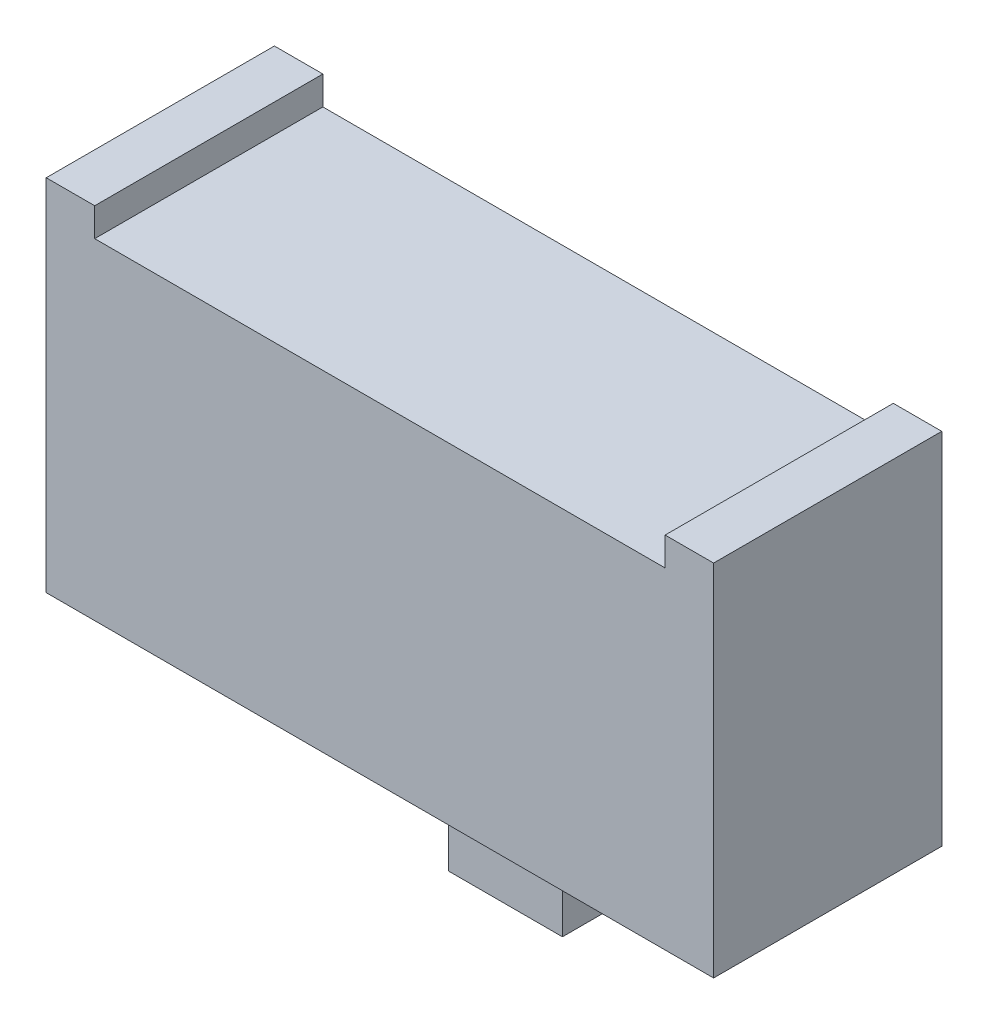
ISO-10303-21;
HEADER;
FILE_DESCRIPTION(('STEP AP214'),'2;1');
FILE_NAME('part.step','',(''),(''),'','','');
FILE_SCHEMA(('AUTOMOTIVE_DESIGN { 1 0 10303 214 1 1 1 1 }'));
ENDSEC;
DATA;
#1=APPLICATION_CONTEXT('core data for automotive mechanical design processes');
#2=APPLICATION_PROTOCOL_DEFINITION('international standard','automotive_design',2000,#1);
#3=PRODUCT_CONTEXT('',#1,'mechanical');
#4=PRODUCT('Part','Part','',(#3));
#5=PRODUCT_RELATED_PRODUCT_CATEGORY('part','',(#4));
#6=PRODUCT_DEFINITION_FORMATION('','',#4);
#7=PRODUCT_DEFINITION_CONTEXT('part definition',#1,'design');
#8=PRODUCT_DEFINITION('design','',#6,#7);
#9=PRODUCT_DEFINITION_SHAPE('','',#8);
#10=(LENGTH_UNIT() NAMED_UNIT(*) SI_UNIT(.MILLI.,.METRE.));
#11=(NAMED_UNIT(*) PLANE_ANGLE_UNIT() SI_UNIT($,.RADIAN.));
#12=(NAMED_UNIT(*) SI_UNIT($,.STERADIAN.) SOLID_ANGLE_UNIT());
#13=UNCERTAINTY_MEASURE_WITH_UNIT(LENGTH_MEASURE(1.E-05),#10,'distance_accuracy_value','');
#14=(GEOMETRIC_REPRESENTATION_CONTEXT(3) GLOBAL_UNCERTAINTY_ASSIGNED_CONTEXT((#13)) GLOBAL_UNIT_ASSIGNED_CONTEXT((#10,
#11,#12)) REPRESENTATION_CONTEXT('',''));
#15=CARTESIAN_POINT('',(0.,0.,0.));
#16=DIRECTION('',(0.,0.,1.));
#17=DIRECTION('',(1.,0.,0.));
#18=AXIS2_PLACEMENT_3D('',#15,#16,#17);
#19=CARTESIAN_POINT('',(37.671429042252,-22.700893810559,-9.79989381056));
#20=DIRECTION('',(1.,0.,0.));
#21=DIRECTION('',(0.,-1.,0.));
#22=AXIS2_PLACEMENT_3D('',#19,#20,#21);
#23=PLANE('',#22);
#24=DIRECTION('',(0.,0.,1.));
#25=VECTOR('',#24,1.);
#26=CARTESIAN_POINT('',(37.671429042252,-22.700893810559,-8.79989381055999));
#27=LINE('',#26,#25);
#28=CARTESIAN_POINT('',(37.671429042252,-22.700893810559,-9.79989381056));
#29=VERTEX_POINT('',#28);
#30=CARTESIAN_POINT('',(37.671429042252,-22.700893810559,-5.79989381055999));
#31=VERTEX_POINT('',#30);
#32=EDGE_CURVE('E224',#29,#31,#27,.T.);
#33=ORIENTED_EDGE('',*,*,#32,.F.);
#34=DIRECTION('',(0.,1.,0.));
#35=VECTOR('',#34,1.);
#36=CARTESIAN_POINT('',(37.671429042252,-25.850893810559,-9.79989381056));
#37=LINE('',#36,#35);
#38=CARTESIAN_POINT('',(37.671429042252,-23.200893810559,-9.79989381056));
#39=VERTEX_POINT('',#38);
#40=EDGE_CURVE('E39',#39,#29,#37,.T.);
#41=ORIENTED_EDGE('',*,*,#40,.F.);
#42=DIRECTION('',(0.,0.,1.));
#43=VECTOR('',#42,1.);
#44=CARTESIAN_POINT('',(37.671429042252,-23.200893810559,-9.79989381056));
#45=LINE('',#44,#43);
#46=CARTESIAN_POINT('',(37.671429042252,-23.200893810559,-5.79989381056));
#47=VERTEX_POINT('',#46);
#48=EDGE_CURVE('E10',#39,#47,#45,.T.);
#49=ORIENTED_EDGE('',*,*,#48,.T.);
#50=DIRECTION('',(0.,-1.,0.));
#51=VECTOR('',#50,1.);
#52=CARTESIAN_POINT('',(37.671429042252,-25.850893810559,-5.79989381056));
#53=LINE('',#52,#51);
#54=EDGE_CURVE('E217',#31,#47,#53,.T.);
#55=ORIENTED_EDGE('',*,*,#54,.F.);
#56=EDGE_LOOP('',(#33,#41,#49,#55));
#57=FACE_BOUND('',#56,.T.);
#58=ADVANCED_FACE('F16',(#57),#23,.F.);
#59=CARTESIAN_POINT('',(27.671429042252,-22.700893810559,-5.79989381056007));
#60=DIRECTION('',(-1.,0.,0.));
#61=DIRECTION('',(0.,0.,-1.));
#62=AXIS2_PLACEMENT_3D('',#59,#60,#61);
#63=PLANE('',#62);
#64=DIRECTION('',(0.,0.,-1.));
#65=VECTOR('',#64,1.);
#66=CARTESIAN_POINT('',(27.671429042252,-22.700893810559,-6.79989381056007));
#67=LINE('',#66,#65);
#68=CARTESIAN_POINT('',(27.671429042252,-22.700893810559,-5.79989381056007));
#69=VERTEX_POINT('',#68);
#70=CARTESIAN_POINT('',(27.671429042252,-22.700893810559,-9.79989381056008));
#71=VERTEX_POINT('',#70);
#72=EDGE_CURVE('E191',#69,#71,#67,.T.);
#73=ORIENTED_EDGE('',*,*,#72,.F.);
#74=DIRECTION('',(0.,1.,0.));
#75=VECTOR('',#74,1.);
#76=CARTESIAN_POINT('',(27.671429042252,-25.850893810559,-5.79989381056008));
#77=LINE('',#76,#75);
#78=CARTESIAN_POINT('',(27.671429042252,-23.200893810559,-5.79989381056008));
#79=VERTEX_POINT('',#78);
#80=EDGE_CURVE('E218',#79,#69,#77,.T.);
#81=ORIENTED_EDGE('',*,*,#80,.F.);
#82=DIRECTION('',(0.,0.,-1.));
#83=VECTOR('',#82,1.);
#84=CARTESIAN_POINT('',(27.671429042252,-23.200893810559,-5.79989381056008));
#85=LINE('',#84,#83);
#86=CARTESIAN_POINT('',(27.671429042252,-23.200893810559,-9.79989381056008));
#87=VERTEX_POINT('',#86);
#88=EDGE_CURVE('E26',#79,#87,#85,.T.);
#89=ORIENTED_EDGE('',*,*,#88,.T.);
#90=DIRECTION('',(0.,-1.,0.));
#91=VECTOR('',#90,1.);
#92=CARTESIAN_POINT('',(27.671429042252,-25.850893810559,-9.79989381056008));
#93=LINE('',#92,#91);
#94=EDGE_CURVE('E228',#71,#87,#93,.T.);
#95=ORIENTED_EDGE('',*,*,#94,.F.);
#96=EDGE_LOOP('',(#73,#81,#89,#95));
#97=FACE_BOUND('',#96,.T.);
#98=ADVANCED_FACE('F642',(#97),#63,.F.);
#99=CARTESIAN_POINT('',(32.671429042252,-23.200893810559,-7.79989381056003));
#100=DIRECTION('',(0.,-1.,0.));
#101=DIRECTION('',(-1.,0.,0.));
#102=AXIS2_PLACEMENT_3D('',#99,#100,#101);
#103=PLANE('',#102);
#104=DIRECTION('',(-1.,0.,0.));
#105=VECTOR('',#104,1.);
#106=CARTESIAN_POINT('',(29.746429042252,-23.200893810559,-5.79989381056006));
#107=LINE('',#106,#105);
#108=EDGE_CURVE('E213',#47,#79,#107,.T.);
#109=ORIENTED_EDGE('',*,*,#108,.F.);
#110=ORIENTED_EDGE('',*,*,#48,.F.);
#111=DIRECTION('',(1.,0.,0.));
#112=VECTOR('',#111,1.);
#113=CARTESIAN_POINT('',(35.596429042252,-23.200893810559,-9.79989381056001));
#114=LINE('',#113,#112);
#115=EDGE_CURVE('E232',#87,#39,#114,.T.);
#116=ORIENTED_EDGE('',*,*,#115,.F.);
#117=ORIENTED_EDGE('',*,*,#88,.F.);
#118=EDGE_LOOP('',(#109,#110,#116,#117));
#119=FACE_BOUND('',#118,.T.);
#120=ADVANCED_FACE('F632',(#119),#103,.F.);
#121=CARTESIAN_POINT('',(32.671429042252,-22.700893810559,-7.79989381056003));
#122=DIRECTION('',(0.,1.,0.));
#123=DIRECTION('',(0.,0.,1.));
#124=AXIS2_PLACEMENT_3D('',#121,#122,#123);
#125=PLANE('',#124);
#126=ORIENTED_EDGE('',*,*,#72,.T.);
#127=DIRECTION('',(-1.,0.,0.));
#128=VECTOR('',#127,1.);
#129=CARTESIAN_POINT('',(38.521429042252,-22.700893810559,-9.79989381055999));
#130=LINE('',#129,#128);
#131=CARTESIAN_POINT('',(26.821429042252,-22.700893810559,-9.79989381056008));
#132=VERTEX_POINT('',#131);
#133=EDGE_CURVE('E195',#71,#132,#130,.T.);
#134=ORIENTED_EDGE('',*,*,#133,.T.);
#135=DIRECTION('',(0.,0.,1.));
#136=VECTOR('',#135,1.);
#137=CARTESIAN_POINT('',(26.821429042252,-22.700893810559,-9.79989381056008));
#138=LINE('',#137,#136);
#139=CARTESIAN_POINT('',(26.821429042252,-22.700893810559,-5.79989381056008));
#140=VERTEX_POINT('',#139);
#141=EDGE_CURVE('E223',#132,#140,#138,.T.);
#142=ORIENTED_EDGE('',*,*,#141,.T.);
#143=DIRECTION('',(1.,0.,0.));
#144=VECTOR('',#143,1.);
#145=CARTESIAN_POINT('',(26.821429042252,-22.700893810559,-5.79989381056008));
#146=LINE('',#145,#144);
#147=EDGE_CURVE('E219',#140,#69,#146,.T.);
#148=ORIENTED_EDGE('',*,*,#147,.T.);
#149=EDGE_LOOP('',(#126,#134,#142,#148));
#150=FACE_BOUND('',#149,.T.);
#151=ADVANCED_FACE('F623',(#150),#125,.T.);
#152=CARTESIAN_POINT('',(32.671429042252,-22.700893810559,-7.79989381056003));
#153=DIRECTION('',(0.,1.,0.));
#154=DIRECTION('',(0.,0.,1.));
#155=AXIS2_PLACEMENT_3D('',#152,#153,#154);
#156=PLANE('',#155);
#157=ORIENTED_EDGE('',*,*,#32,.T.);
#158=DIRECTION('',(1.,0.,0.));
#159=VECTOR('',#158,1.);
#160=CARTESIAN_POINT('',(26.821429042252,-22.700893810559,-5.79989381056008));
#161=LINE('',#160,#159);
#162=CARTESIAN_POINT('',(38.521429042252,-22.700893810559,-5.79989381055999));
#163=VERTEX_POINT('',#162);
#164=EDGE_CURVE('E300',#31,#163,#161,.T.);
#165=ORIENTED_EDGE('',*,*,#164,.T.);
#166=DIRECTION('',(0.,0.,-1.));
#167=VECTOR('',#166,1.);
#168=CARTESIAN_POINT('',(38.521429042252,-22.700893810559,-5.79989381055999));
#169=LINE('',#168,#167);
#170=CARTESIAN_POINT('',(38.521429042252,-22.700893810559,-9.79989381055999));
#171=VERTEX_POINT('',#170);
#172=EDGE_CURVE('E296',#163,#171,#169,.T.);
#173=ORIENTED_EDGE('',*,*,#172,.T.);
#174=DIRECTION('',(-1.,0.,0.));
#175=VECTOR('',#174,1.);
#176=CARTESIAN_POINT('',(38.521429042252,-22.700893810559,-9.79989381055999));
#177=LINE('',#176,#175);
#178=EDGE_CURVE('E301',#171,#29,#177,.T.);
#179=ORIENTED_EDGE('',*,*,#178,.T.);
#180=EDGE_LOOP('',(#157,#165,#173,#179));
#181=FACE_BOUND('',#180,.T.);
#182=ADVANCED_FACE('F344',(#181),#156,.T.);
#183=CARTESIAN_POINT('',(26.821429042252,-29.000893810559,-5.79989381056009));
#184=DIRECTION('',(0.,0.,1.));
#185=DIRECTION('',(0.,1.,0.));
#186=AXIS2_PLACEMENT_3D('',#183,#184,#185);
#187=PLANE('',#186);
#188=ORIENTED_EDGE('',*,*,#54,.T.);
#189=ORIENTED_EDGE('',*,*,#108,.T.);
#190=ORIENTED_EDGE('',*,*,#80,.T.);
#191=ORIENTED_EDGE('',*,*,#147,.F.);
#192=DIRECTION('',(0.,1.,0.));
#193=VECTOR('',#192,1.);
#194=CARTESIAN_POINT('',(26.821429042252,-29.000893810559,-5.79989381056009));
#195=LINE('',#194,#193);
#196=CARTESIAN_POINT('',(26.821429042252,-29.000893810559,-5.79989381056009));
#197=VERTEX_POINT('',#196);
#198=EDGE_CURVE('E202',#197,#140,#195,.T.);
#199=ORIENTED_EDGE('',*,*,#198,.F.);
#200=DIRECTION('',(1.,0.,0.));
#201=VECTOR('',#200,1.);
#202=CARTESIAN_POINT('',(26.821429042252,-29.000893810559,-5.79989381056009));
#203=LINE('',#202,#201);
#204=CARTESIAN_POINT('',(38.521429042252,-29.000893810559,-5.79989381056));
#205=VERTEX_POINT('',#204);
#206=EDGE_CURVE('E265',#197,#205,#203,.T.);
#207=ORIENTED_EDGE('',*,*,#206,.T.);
#208=DIRECTION('',(0.,1.,0.));
#209=VECTOR('',#208,1.);
#210=CARTESIAN_POINT('',(38.521429042252,-29.000893810559,-5.79989381056));
#211=LINE('',#210,#209);
#212=EDGE_CURVE('E261',#205,#163,#211,.T.);
#213=ORIENTED_EDGE('',*,*,#212,.T.);
#214=ORIENTED_EDGE('',*,*,#164,.F.);
#215=EDGE_LOOP('',(#188,#189,#190,#191,#199,#207,#213,#214));
#216=FACE_BOUND('',#215,.T.);
#217=ADVANCED_FACE('F346',(#216),#187,.T.);
#218=CARTESIAN_POINT('',(34.871429042252,-29.000893810559,-8.79989381056003));
#219=DIRECTION('',(1.,0.,0.));
#220=DIRECTION('',(0.,-1.,0.));
#221=AXIS2_PLACEMENT_3D('',#218,#219,#220);
#222=PLANE('',#221);
#223=DIRECTION('',(0.,0.,-1.));
#224=VECTOR('',#223,1.);
#225=CARTESIAN_POINT('',(34.871429042252,-29.000893810559,-7.29989381056003));
#226=LINE('',#225,#224);
#227=CARTESIAN_POINT('',(34.871429042252,-29.000893810559,-6.79989381056003));
#228=VERTEX_POINT('',#227);
#229=CARTESIAN_POINT('',(34.871429042252,-29.000893810559,-8.79989381056003));
#230=VERTEX_POINT('',#229);
#231=EDGE_CURVE('E244',#228,#230,#226,.T.);
#232=ORIENTED_EDGE('',*,*,#231,.F.);
#233=DIRECTION('',(0.,1.,0.));
#234=VECTOR('',#233,1.);
#235=CARTESIAN_POINT('',(34.871429042252,-29.000893810559,-6.79989381056003));
#236=LINE('',#235,#234);
#237=CARTESIAN_POINT('',(34.871429042252,-30.700893810559,-6.79989381056003));
#238=VERTEX_POINT('',#237);
#239=EDGE_CURVE('E177',#238,#228,#236,.T.);
#240=ORIENTED_EDGE('',*,*,#239,.F.);
#241=DIRECTION('',(0.,0.,1.));
#242=VECTOR('',#241,1.);
#243=CARTESIAN_POINT('',(34.871429042252,-30.700893810559,-6.79989381056003));
#244=LINE('',#243,#242);
#245=CARTESIAN_POINT('',(34.871429042252,-30.700893810559,-8.79989381056003));
#246=VERTEX_POINT('',#245);
#247=EDGE_CURVE('E180',#246,#238,#244,.T.);
#248=ORIENTED_EDGE('',*,*,#247,.F.);
#249=DIRECTION('',(0.,-1.,0.));
#250=VECTOR('',#249,1.);
#251=CARTESIAN_POINT('',(34.871429042252,-29.000893810559,-8.79989381056003));
#252=LINE('',#251,#250);
#253=EDGE_CURVE('E266',#230,#246,#252,.T.);
#254=ORIENTED_EDGE('',*,*,#253,.F.);
#255=EDGE_LOOP('',(#232,#240,#248,#254));
#256=FACE_BOUND('',#255,.T.);
#257=ADVANCED_FACE('F594',(#256),#222,.T.);
#258=CARTESIAN_POINT('',(32.871429042252,-29.000893810559,-8.79989381056005));
#259=DIRECTION('',(0.,0.,-1.));
#260=DIRECTION('',(-1.,0.,0.));
#261=AXIS2_PLACEMENT_3D('',#258,#259,#260);
#262=PLANE('',#261);
#263=DIRECTION('',(-1.,0.,0.));
#264=VECTOR('',#263,1.);
#265=CARTESIAN_POINT('',(33.771429042252,-29.000893810559,-8.79989381056004));
#266=LINE('',#265,#264);
#267=CARTESIAN_POINT('',(32.871429042252,-29.000893810559,-8.79989381056005));
#268=VERTEX_POINT('',#267);
#269=EDGE_CURVE('E242',#230,#268,#266,.T.);
#270=ORIENTED_EDGE('',*,*,#269,.F.);
#271=ORIENTED_EDGE('',*,*,#253,.T.);
#272=DIRECTION('',(1.,0.,0.));
#273=VECTOR('',#272,1.);
#274=CARTESIAN_POINT('',(34.871429042252,-30.700893810559,-8.79989381056003));
#275=LINE('',#274,#273);
#276=CARTESIAN_POINT('',(32.871429042252,-30.700893810559,-8.79989381056005));
#277=VERTEX_POINT('',#276);
#278=EDGE_CURVE('E167',#277,#246,#275,.T.);
#279=ORIENTED_EDGE('',*,*,#278,.F.);
#280=DIRECTION('',(0.,-1.,0.));
#281=VECTOR('',#280,1.);
#282=CARTESIAN_POINT('',(32.871429042252,-29.000893810559,-8.79989381056005));
#283=LINE('',#282,#281);
#284=EDGE_CURVE('E161',#268,#277,#283,.T.);
#285=ORIENTED_EDGE('',*,*,#284,.F.);
#286=EDGE_LOOP('',(#270,#271,#279,#285));
#287=FACE_BOUND('',#286,.T.);
#288=ADVANCED_FACE('F586',(#287),#262,.T.);
#289=CARTESIAN_POINT('',(32.871429042252,-29.000893810559,-6.79989381056004));
#290=DIRECTION('',(-1.,0.,0.));
#291=DIRECTION('',(0.,0.,-1.));
#292=AXIS2_PLACEMENT_3D('',#289,#290,#291);
#293=PLANE('',#292);
#294=DIRECTION('',(0.,1.,0.));
#295=VECTOR('',#294,1.);
#296=CARTESIAN_POINT('',(32.871429042252,-29.000893810559,-8.79989381056005));
#297=LINE('',#296,#295);
#298=CARTESIAN_POINT('',(32.871429042252,-28.500893810559,-8.79989381056004));
#299=VERTEX_POINT('',#298);
#300=EDGE_CURVE('E283',#268,#299,#297,.T.);
#301=ORIENTED_EDGE('',*,*,#300,.F.);
#302=ORIENTED_EDGE('',*,*,#284,.T.);
#303=DIRECTION('',(0.,0.,-1.));
#304=VECTOR('',#303,1.);
#305=CARTESIAN_POINT('',(32.871429042252,-30.700893810559,-8.79989381056005));
#306=LINE('',#305,#304);
#307=CARTESIAN_POINT('',(32.871429042252,-30.700893810559,-6.79989381056005));
#308=VERTEX_POINT('',#307);
#309=EDGE_CURVE('E154',#308,#277,#306,.T.);
#310=ORIENTED_EDGE('',*,*,#309,.F.);
#311=DIRECTION('',(0.,-1.,0.));
#312=VECTOR('',#311,1.);
#313=CARTESIAN_POINT('',(32.871429042252,-29.000893810559,-6.79989381056004));
#314=LINE('',#313,#312);
#315=CARTESIAN_POINT('',(32.871429042252,-29.000893810559,-6.79989381056004));
#316=VERTEX_POINT('',#315);
#317=EDGE_CURVE('E158',#316,#308,#314,.T.);
#318=ORIENTED_EDGE('',*,*,#317,.F.);
#319=DIRECTION('',(0.,-1.,0.));
#320=VECTOR('',#319,1.);
#321=CARTESIAN_POINT('',(32.871429042252,-29.000893810559,-6.79989381056004));
#322=LINE('',#321,#320);
#323=CARTESIAN_POINT('',(32.871429042252,-28.500893810559,-6.79989381056004));
#324=VERTEX_POINT('',#323);
#325=EDGE_CURVE('E310',#324,#316,#322,.T.);
#326=ORIENTED_EDGE('',*,*,#325,.F.);
#327=DIRECTION('',(0.,0.,1.));
#328=VECTOR('',#327,1.);
#329=CARTESIAN_POINT('',(32.871429042252,-28.500893810559,-7.29989381056004));
#330=LINE('',#329,#328);
#331=EDGE_CURVE('E201',#299,#324,#330,.T.);
#332=ORIENTED_EDGE('',*,*,#331,.F.);
#333=EDGE_LOOP('',(#301,#302,#310,#318,#326,#332));
#334=FACE_BOUND('',#333,.T.);
#335=ADVANCED_FACE('F18',(#334),#293,.T.);
#336=CARTESIAN_POINT('',(34.871429042252,-29.000893810559,-6.79989381056003));
#337=DIRECTION('',(0.,0.,1.));
#338=DIRECTION('',(1.,0.,0.));
#339=AXIS2_PLACEMENT_3D('',#336,#337,#338);
#340=PLANE('',#339);
#341=DIRECTION('',(1.,0.,0.));
#342=VECTOR('',#341,1.);
#343=CARTESIAN_POINT('',(31.571429042252,-29.000893810559,-6.79989381056006));
#344=LINE('',#343,#342);
#345=EDGE_CURVE('E174',#316,#228,#344,.T.);
#346=ORIENTED_EDGE('',*,*,#345,.F.);
#347=ORIENTED_EDGE('',*,*,#317,.T.);
#348=DIRECTION('',(-1.,0.,0.));
#349=VECTOR('',#348,1.);
#350=CARTESIAN_POINT('',(32.871429042252,-30.700893810559,-6.79989381056005));
#351=LINE('',#350,#349);
#352=EDGE_CURVE('E166',#238,#308,#351,.T.);
#353=ORIENTED_EDGE('',*,*,#352,.F.);
#354=ORIENTED_EDGE('',*,*,#239,.T.);
#355=EDGE_LOOP('',(#346,#347,#353,#354));
#356=FACE_BOUND('',#355,.T.);
#357=ADVANCED_FACE('F171',(#356),#340,.T.);
#358=CARTESIAN_POINT('',(33.871429042252,-30.700893810559,-7.79989381056004));
#359=DIRECTION('',(0.,-1.,0.));
#360=DIRECTION('',(-1.,0.,0.));
#361=AXIS2_PLACEMENT_3D('',#358,#359,#360);
#362=PLANE('',#361);
#363=ORIENTED_EDGE('',*,*,#352,.T.);
#364=ORIENTED_EDGE('',*,*,#309,.T.);
#365=ORIENTED_EDGE('',*,*,#278,.T.);
#366=ORIENTED_EDGE('',*,*,#247,.T.);
#367=EDGE_LOOP('',(#363,#364,#365,#366));
#368=FACE_BOUND('',#367,.T.);
#369=ADVANCED_FACE('F179',(#368),#362,.T.);
#370=CARTESIAN_POINT('',(34.871429042252,-29.000893810559,-8.79989381056003));
#371=DIRECTION('',(0.,0.,-1.));
#372=DIRECTION('',(-1.,0.,0.));
#373=AXIS2_PLACEMENT_3D('',#370,#371,#372);
#374=PLANE('',#373);
#375=ORIENTED_EDGE('',*,*,#300,.T.);
#376=DIRECTION('',(-1.,0.,0.));
#377=VECTOR('',#376,1.);
#378=CARTESIAN_POINT('',(34.871429042252,-28.500893810559,-8.79989381056003));
#379=LINE('',#378,#377);
#380=CARTESIAN_POINT('',(30.471429042252,-28.500893810559,-8.79989381056006));
#381=VERTEX_POINT('',#380);
#382=EDGE_CURVE('E276',#299,#381,#379,.T.);
#383=ORIENTED_EDGE('',*,*,#382,.T.);
#384=DIRECTION('',(0.,1.,0.));
#385=VECTOR('',#384,1.);
#386=CARTESIAN_POINT('',(30.471429042252,-29.000893810559,-8.79989381056006));
#387=LINE('',#386,#385);
#388=CARTESIAN_POINT('',(30.471429042252,-29.000893810559,-8.79989381056006));
#389=VERTEX_POINT('',#388);
#390=EDGE_CURVE('E273',#389,#381,#387,.T.);
#391=ORIENTED_EDGE('',*,*,#390,.F.);
#392=DIRECTION('',(-1.,0.,0.));
#393=VECTOR('',#392,1.);
#394=CARTESIAN_POINT('',(33.771429042252,-29.000893810559,-8.79989381056004));
#395=LINE('',#394,#393);
#396=EDGE_CURVE('E245',#268,#389,#395,.T.);
#397=ORIENTED_EDGE('',*,*,#396,.F.);
#398=EDGE_LOOP('',(#375,#383,#391,#397));
#399=FACE_BOUND('',#398,.T.);
#400=ADVANCED_FACE('F548',(#399),#374,.F.);
#401=CARTESIAN_POINT('',(30.471429042252,-29.000893810559,-8.79989381056006));
#402=DIRECTION('',(-1.,0.,0.));
#403=DIRECTION('',(0.,0.,-1.));
#404=AXIS2_PLACEMENT_3D('',#401,#402,#403);
#405=PLANE('',#404);
#406=DIRECTION('',(0.,0.,1.));
#407=VECTOR('',#406,1.);
#408=CARTESIAN_POINT('',(30.471429042252,-29.000893810559,-8.29989381056006));
#409=LINE('',#408,#407);
#410=CARTESIAN_POINT('',(30.471429042252,-29.000893810559,-6.79989381056006));
#411=VERTEX_POINT('',#410);
#412=EDGE_CURVE('E212',#389,#411,#409,.T.);
#413=ORIENTED_EDGE('',*,*,#412,.F.);
#414=ORIENTED_EDGE('',*,*,#390,.T.);
#415=DIRECTION('',(0.,0.,1.));
#416=VECTOR('',#415,1.);
#417=CARTESIAN_POINT('',(30.471429042252,-28.500893810559,-8.79989381056006));
#418=LINE('',#417,#416);
#419=CARTESIAN_POINT('',(30.471429042252,-28.500893810559,-6.79989381056006));
#420=VERTEX_POINT('',#419);
#421=EDGE_CURVE('E277',#381,#420,#418,.T.);
#422=ORIENTED_EDGE('',*,*,#421,.T.);
#423=DIRECTION('',(0.,1.,0.));
#424=VECTOR('',#423,1.);
#425=CARTESIAN_POINT('',(30.471429042252,-29.000893810559,-6.79989381056006));
#426=LINE('',#425,#424);
#427=EDGE_CURVE('E200',#411,#420,#426,.T.);
#428=ORIENTED_EDGE('',*,*,#427,.F.);
#429=EDGE_LOOP('',(#413,#414,#422,#428));
#430=FACE_BOUND('',#429,.T.);
#431=ADVANCED_FACE('F538',(#430),#405,.F.);
#432=CARTESIAN_POINT('',(30.471429042252,-29.000893810559,-6.79989381056006));
#433=DIRECTION('',(0.,0.,1.));
#434=DIRECTION('',(0.,1.,0.));
#435=AXIS2_PLACEMENT_3D('',#432,#433,#434);
#436=PLANE('',#435);
#437=ORIENTED_EDGE('',*,*,#325,.T.);
#438=DIRECTION('',(1.,0.,0.));
#439=VECTOR('',#438,1.);
#440=CARTESIAN_POINT('',(31.571429042252,-29.000893810559,-6.79989381056006));
#441=LINE('',#440,#439);
#442=EDGE_CURVE('E225',#411,#316,#441,.T.);
#443=ORIENTED_EDGE('',*,*,#442,.F.);
#444=ORIENTED_EDGE('',*,*,#427,.T.);
#445=DIRECTION('',(1.,0.,0.));
#446=VECTOR('',#445,1.);
#447=CARTESIAN_POINT('',(30.471429042252,-28.500893810559,-6.79989381056006));
#448=LINE('',#447,#446);
#449=EDGE_CURVE('E196',#420,#324,#448,.T.);
#450=ORIENTED_EDGE('',*,*,#449,.T.);
#451=EDGE_LOOP('',(#437,#443,#444,#450));
#452=FACE_BOUND('',#451,.T.);
#453=ADVANCED_FACE('F527',(#452),#436,.F.);
#454=CARTESIAN_POINT('',(32.671429042252,-28.500893810559,-7.79989381056005));
#455=DIRECTION('',(0.,1.,0.));
#456=DIRECTION('',(0.,0.,1.));
#457=AXIS2_PLACEMENT_3D('',#454,#455,#456);
#458=PLANE('',#457);
#459=ORIENTED_EDGE('',*,*,#331,.T.);
#460=ORIENTED_EDGE('',*,*,#449,.F.);
#461=ORIENTED_EDGE('',*,*,#421,.F.);
#462=ORIENTED_EDGE('',*,*,#382,.F.);
#463=EDGE_LOOP('',(#459,#460,#461,#462));
#464=FACE_BOUND('',#463,.T.);
#465=ADVANCED_FACE('F514',(#464),#458,.F.);
#466=CARTESIAN_POINT('',(26.821429042252,-29.000893810559,-9.79989381056009));
#467=DIRECTION('',(-1.,0.,0.));
#468=DIRECTION('',(0.,0.,-1.));
#469=AXIS2_PLACEMENT_3D('',#466,#467,#468);
#470=PLANE('',#469);
#471=DIRECTION('',(0.,0.,1.));
#472=VECTOR('',#471,1.);
#473=CARTESIAN_POINT('',(26.821429042252,-29.000893810559,-9.79989381056009));
#474=LINE('',#473,#472);
#475=CARTESIAN_POINT('',(26.821429042252,-29.000893810559,-9.79989381056009));
#476=VERTEX_POINT('',#475);
#477=EDGE_CURVE('E205',#476,#197,#474,.T.);
#478=ORIENTED_EDGE('',*,*,#477,.T.);
#479=ORIENTED_EDGE('',*,*,#198,.T.);
#480=ORIENTED_EDGE('',*,*,#141,.F.);
#481=DIRECTION('',(0.,1.,0.));
#482=VECTOR('',#481,1.);
#483=CARTESIAN_POINT('',(26.821429042252,-29.000893810559,-9.79989381056009));
#484=LINE('',#483,#482);
#485=EDGE_CURVE('E231',#476,#132,#484,.T.);
#486=ORIENTED_EDGE('',*,*,#485,.F.);
#487=EDGE_LOOP('',(#478,#479,#480,#486));
#488=FACE_BOUND('',#487,.T.);
#489=ADVANCED_FACE('F503',(#488),#470,.T.);
#490=CARTESIAN_POINT('',(38.521429042252,-29.000893810559,-9.79989381056));
#491=DIRECTION('',(0.,0.,-1.));
#492=DIRECTION('',(-1.,0.,0.));
#493=AXIS2_PLACEMENT_3D('',#490,#491,#492);
#494=PLANE('',#493);
#495=ORIENTED_EDGE('',*,*,#40,.T.);
#496=ORIENTED_EDGE('',*,*,#178,.F.);
#497=DIRECTION('',(0.,1.,0.));
#498=VECTOR('',#497,1.);
#499=CARTESIAN_POINT('',(38.521429042252,-29.000893810559,-9.79989381056));
#500=LINE('',#499,#498);
#501=CARTESIAN_POINT('',(38.521429042252,-29.000893810559,-9.79989381056));
#502=VERTEX_POINT('',#501);
#503=EDGE_CURVE('E207',#502,#171,#500,.T.);
#504=ORIENTED_EDGE('',*,*,#503,.F.);
#505=DIRECTION('',(-1.,0.,0.));
#506=VECTOR('',#505,1.);
#507=CARTESIAN_POINT('',(38.521429042252,-29.000893810559,-9.79989381056));
#508=LINE('',#507,#506);
#509=EDGE_CURVE('E241',#502,#476,#508,.T.);
#510=ORIENTED_EDGE('',*,*,#509,.T.);
#511=ORIENTED_EDGE('',*,*,#485,.T.);
#512=ORIENTED_EDGE('',*,*,#133,.F.);
#513=ORIENTED_EDGE('',*,*,#94,.T.);
#514=ORIENTED_EDGE('',*,*,#115,.T.);
#515=EDGE_LOOP('',(#495,#496,#504,#510,#511,#512,#513,#514));
#516=FACE_BOUND('',#515,.T.);
#517=ADVANCED_FACE('F353',(#516),#494,.T.);
#518=CARTESIAN_POINT('',(38.521429042252,-29.000893810559,-5.79989381056));
#519=DIRECTION('',(1.,0.,0.));
#520=DIRECTION('',(0.,-1.,0.));
#521=AXIS2_PLACEMENT_3D('',#518,#519,#520);
#522=PLANE('',#521);
#523=DIRECTION('',(0.,0.,-1.));
#524=VECTOR('',#523,1.);
#525=CARTESIAN_POINT('',(38.521429042252,-29.000893810559,-5.79989381056));
#526=LINE('',#525,#524);
#527=EDGE_CURVE('E211',#205,#502,#526,.T.);
#528=ORIENTED_EDGE('',*,*,#527,.T.);
#529=ORIENTED_EDGE('',*,*,#503,.T.);
#530=ORIENTED_EDGE('',*,*,#172,.F.);
#531=ORIENTED_EDGE('',*,*,#212,.F.);
#532=EDGE_LOOP('',(#528,#529,#530,#531));
#533=FACE_BOUND('',#532,.T.);
#534=ADVANCED_FACE('F350',(#533),#522,.T.);
#535=CARTESIAN_POINT('',(32.671429042252,-29.000893810559,-7.79989381056005));
#536=DIRECTION('',(0.,-1.,0.));
#537=DIRECTION('',(-1.,0.,0.));
#538=AXIS2_PLACEMENT_3D('',#535,#536,#537);
#539=PLANE('',#538);
#540=ORIENTED_EDGE('',*,*,#206,.F.);
#541=ORIENTED_EDGE('',*,*,#477,.F.);
#542=ORIENTED_EDGE('',*,*,#509,.F.);
#543=ORIENTED_EDGE('',*,*,#527,.F.);
#544=EDGE_LOOP('',(#540,#541,#542,#543));
#545=FACE_BOUND('',#544,.T.);
#546=ORIENTED_EDGE('',*,*,#412,.T.);
#547=ORIENTED_EDGE('',*,*,#442,.T.);
#548=ORIENTED_EDGE('',*,*,#345,.T.);
#549=ORIENTED_EDGE('',*,*,#231,.T.);
#550=ORIENTED_EDGE('',*,*,#269,.T.);
#551=ORIENTED_EDGE('',*,*,#396,.T.);
#552=EDGE_LOOP('',(#546,#547,#548,#549,#550,#551));
#553=FACE_BOUND('',#552,.T.);
#554=ADVANCED_FACE('F356',(#545,#553),#539,.T.);
#555=CLOSED_SHELL('',(#58,#98,#120,#151,#182,#217,#257,#288,#335,#357,#369,#400,#431,#453,#465,
#489,#517,#534,#554));
#556=MANIFOLD_SOLID_BREP('B1',#555);
#557=ADVANCED_BREP_SHAPE_REPRESENTATION('',(#18,#556),#14);
#558=SHAPE_DEFINITION_REPRESENTATION(#9,#557);
ENDSEC;
END-ISO-10303-21;
